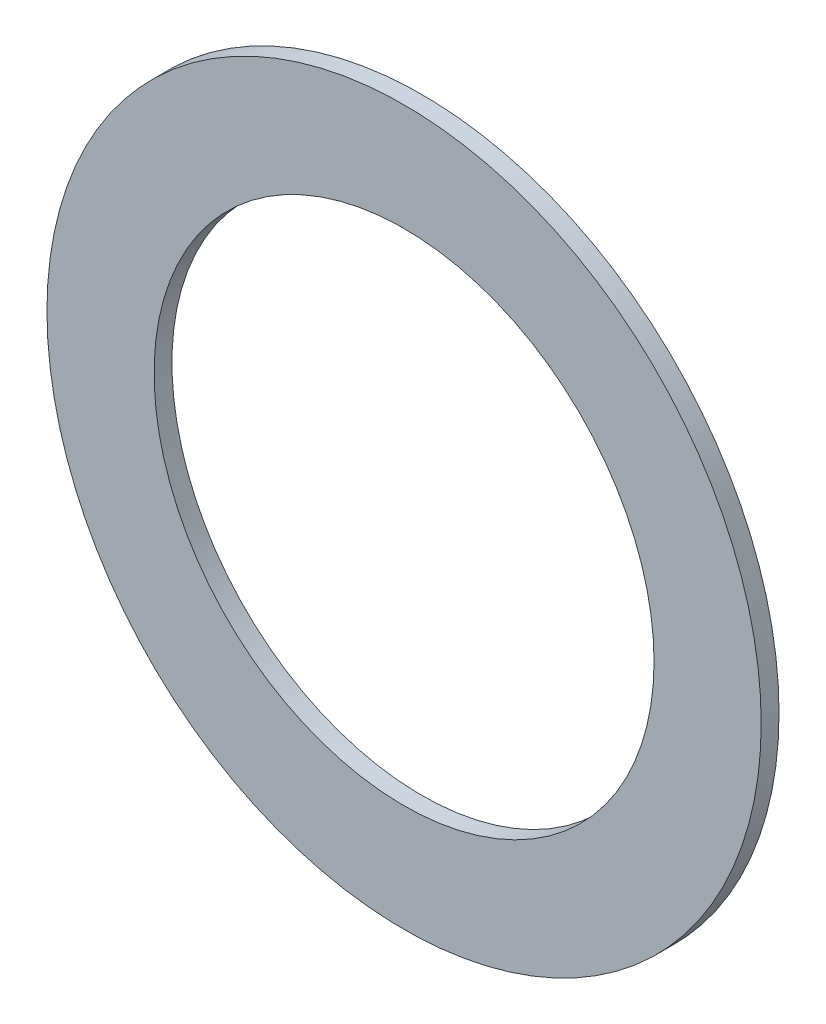
ISO-10303-21;
HEADER;
FILE_DESCRIPTION(('STEP AP214'),'2;1');
FILE_NAME('part.step','',(''),(''),'','','');
FILE_SCHEMA(('AUTOMOTIVE_DESIGN { 1 0 10303 214 1 1 1 1 }'));
ENDSEC;
DATA;
#1=APPLICATION_CONTEXT('core data for automotive mechanical design processes');
#2=APPLICATION_PROTOCOL_DEFINITION('international standard','automotive_design',2000,#1);
#3=PRODUCT_CONTEXT('',#1,'mechanical');
#4=PRODUCT('Part','Part','',(#3));
#5=PRODUCT_RELATED_PRODUCT_CATEGORY('part','',(#4));
#6=PRODUCT_DEFINITION_FORMATION('','',#4);
#7=PRODUCT_DEFINITION_CONTEXT('part definition',#1,'design');
#8=PRODUCT_DEFINITION('design','',#6,#7);
#9=PRODUCT_DEFINITION_SHAPE('','',#8);
#10=(LENGTH_UNIT() NAMED_UNIT(*) SI_UNIT(.MILLI.,.METRE.));
#11=(NAMED_UNIT(*) PLANE_ANGLE_UNIT() SI_UNIT($,.RADIAN.));
#12=(NAMED_UNIT(*) SI_UNIT($,.STERADIAN.) SOLID_ANGLE_UNIT());
#13=UNCERTAINTY_MEASURE_WITH_UNIT(LENGTH_MEASURE(1.E-05),#10,'distance_accuracy_value','');
#14=(GEOMETRIC_REPRESENTATION_CONTEXT(3) GLOBAL_UNCERTAINTY_ASSIGNED_CONTEXT((#13)) GLOBAL_UNIT_ASSIGNED_CONTEXT((#10,
#11,#12)) REPRESENTATION_CONTEXT('',''));
#15=CARTESIAN_POINT('',(0.,0.,0.));
#16=DIRECTION('',(0.,0.,1.));
#17=DIRECTION('',(1.,0.,0.));
#18=AXIS2_PLACEMENT_3D('',#15,#16,#17);
#19=CARTESIAN_POINT('',(0.,0.,-1.5875));
#20=DIRECTION('',(0.,0.,1.));
#21=DIRECTION('',(1.,0.,0.));
#22=AXIS2_PLACEMENT_3D('',#19,#20,#21);
#23=CYLINDRICAL_SURFACE('',#22,31.75);
#24=CARTESIAN_POINT('',(0.,0.,-1.5875));
#25=DIRECTION('',(0.,0.,1.));
#26=DIRECTION('',(1.,0.,0.));
#27=AXIS2_PLACEMENT_3D('',#24,#25,#26);
#28=CIRCLE('',#27,31.75);
#29=CARTESIAN_POINT('',(31.75,0.,-1.5875));
#30=VERTEX_POINT('',#29);
#31=EDGE_CURVE('E10',#30,#30,#28,.T.);
#32=ORIENTED_EDGE('',*,*,#31,.T.);
#33=EDGE_LOOP('',(#32));
#34=FACE_BOUND('',#33,.T.);
#35=CARTESIAN_POINT('',(0.,0.,0.));
#36=DIRECTION('',(0.,0.,1.));
#37=DIRECTION('',(1.,0.,0.));
#38=AXIS2_PLACEMENT_3D('',#35,#36,#37);
#39=CIRCLE('',#38,31.75);
#40=CARTESIAN_POINT('',(31.75,0.,0.));
#41=VERTEX_POINT('',#40);
#42=EDGE_CURVE('E46',#41,#41,#39,.T.);
#43=ORIENTED_EDGE('',*,*,#42,.F.);
#44=EDGE_LOOP('',(#43));
#45=FACE_BOUND('',#44,.T.);
#46=ADVANCED_FACE('F43',(#34,#45),#23,.T.);
#47=CARTESIAN_POINT('',(0.,0.,-1.5875));
#48=DIRECTION('',(0.,0.,1.));
#49=DIRECTION('',(1.,0.,0.));
#50=AXIS2_PLACEMENT_3D('',#47,#48,#49);
#51=PLANE('',#50);
#52=CARTESIAN_POINT('',(0.,0.,-1.5875));
#53=DIRECTION('',(0.,0.,1.));
#54=DIRECTION('',(1.,0.,0.));
#55=AXIS2_PLACEMENT_3D('',#52,#53,#54);
#56=CIRCLE('',#55,22.225);
#57=CARTESIAN_POINT('',(22.225,0.,-1.5875));
#58=VERTEX_POINT('',#57);
#59=EDGE_CURVE('E55',#58,#58,#56,.T.);
#60=ORIENTED_EDGE('',*,*,#59,.T.);
#61=EDGE_LOOP('',(#60));
#62=FACE_BOUND('',#61,.T.);
#63=ORIENTED_EDGE('',*,*,#31,.F.);
#64=EDGE_LOOP('',(#63));
#65=FACE_BOUND('',#64,.T.);
#66=ADVANCED_FACE('F65',(#62,#65),#51,.F.);
#67=CARTESIAN_POINT('',(0.,0.,0.));
#68=DIRECTION('',(0.,0.,1.));
#69=DIRECTION('',(1.,0.,0.));
#70=AXIS2_PLACEMENT_3D('',#67,#68,#69);
#71=PLANE('',#70);
#72=CARTESIAN_POINT('',(0.,0.,0.));
#73=DIRECTION('',(0.,0.,1.));
#74=DIRECTION('',(1.,0.,0.));
#75=AXIS2_PLACEMENT_3D('',#72,#73,#74);
#76=CIRCLE('',#75,22.225);
#77=CARTESIAN_POINT('',(22.225,0.,0.));
#78=VERTEX_POINT('',#77);
#79=EDGE_CURVE('E57',#78,#78,#76,.T.);
#80=ORIENTED_EDGE('',*,*,#79,.F.);
#81=EDGE_LOOP('',(#80));
#82=FACE_BOUND('',#81,.T.);
#83=ORIENTED_EDGE('',*,*,#42,.T.);
#84=EDGE_LOOP('',(#83));
#85=FACE_BOUND('',#84,.T.);
#86=ADVANCED_FACE('F71',(#82,#85),#71,.T.);
#87=CARTESIAN_POINT('',(0.,0.,-1.5875));
#88=DIRECTION('',(0.,0.,1.));
#89=DIRECTION('',(1.,0.,0.));
#90=AXIS2_PLACEMENT_3D('',#87,#88,#89);
#91=CYLINDRICAL_SURFACE('',#90,22.225);
#92=ORIENTED_EDGE('',*,*,#59,.F.);
#93=EDGE_LOOP('',(#92));
#94=FACE_BOUND('',#93,.T.);
#95=ORIENTED_EDGE('',*,*,#79,.T.);
#96=EDGE_LOOP('',(#95));
#97=FACE_BOUND('',#96,.T.);
#98=ADVANCED_FACE('F68',(#94,#97),#91,.F.);
#99=CLOSED_SHELL('',(#46,#66,#86,#98));
#100=MANIFOLD_SOLID_BREP('B2',#99);
#101=ADVANCED_BREP_SHAPE_REPRESENTATION('',(#18,#100),#14);
#102=SHAPE_DEFINITION_REPRESENTATION(#9,#101);
ENDSEC;
END-ISO-10303-21;
